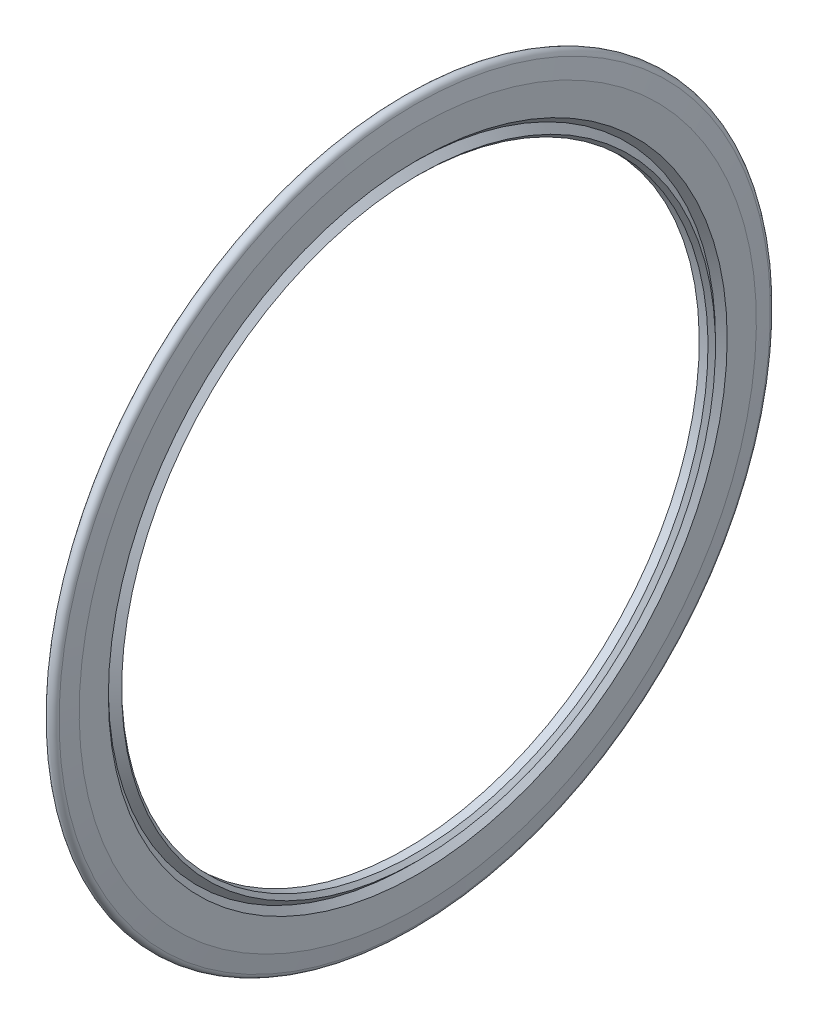
ISO-10303-21;
HEADER;
FILE_DESCRIPTION(('STEP AP214'),'2;1');
FILE_NAME('part.step','',(''),(''),'','','');
FILE_SCHEMA(('AUTOMOTIVE_DESIGN { 1 0 10303 214 1 1 1 1 }'));
ENDSEC;
DATA;
#1=APPLICATION_CONTEXT('core data for automotive mechanical design processes');
#2=APPLICATION_PROTOCOL_DEFINITION('international standard','automotive_design',2000,#1);
#3=PRODUCT_CONTEXT('',#1,'mechanical');
#4=PRODUCT('Part','Part','',(#3));
#5=PRODUCT_RELATED_PRODUCT_CATEGORY('part','',(#4));
#6=PRODUCT_DEFINITION_FORMATION('','',#4);
#7=PRODUCT_DEFINITION_CONTEXT('part definition',#1,'design');
#8=PRODUCT_DEFINITION('design','',#6,#7);
#9=PRODUCT_DEFINITION_SHAPE('','',#8);
#10=(LENGTH_UNIT() NAMED_UNIT(*) SI_UNIT(.MILLI.,.METRE.));
#11=(NAMED_UNIT(*) PLANE_ANGLE_UNIT() SI_UNIT($,.RADIAN.));
#12=(NAMED_UNIT(*) SI_UNIT($,.STERADIAN.) SOLID_ANGLE_UNIT());
#13=UNCERTAINTY_MEASURE_WITH_UNIT(LENGTH_MEASURE(1.E-05),#10,'distance_accuracy_value','');
#14=(GEOMETRIC_REPRESENTATION_CONTEXT(3) GLOBAL_UNCERTAINTY_ASSIGNED_CONTEXT((#13)) GLOBAL_UNIT_ASSIGNED_CONTEXT((#10,
#11,#12)) REPRESENTATION_CONTEXT('',''));
#15=CARTESIAN_POINT('',(0.,0.,0.));
#16=DIRECTION('',(0.,0.,1.));
#17=DIRECTION('',(1.,0.,0.));
#18=AXIS2_PLACEMENT_3D('',#15,#16,#17);
#19=CARTESIAN_POINT('',(0.135,16.14177,0.));
#20=DIRECTION('',(-1.,0.,0.));
#21=DIRECTION('',(0.,-1.,0.));
#22=AXIS2_PLACEMENT_3D('',#19,#20,#21);
#23=PLANE('',#22);
#24=CARTESIAN_POINT('',(0.135,0.,0.));
#25=DIRECTION('',(1.,0.,0.));
#26=DIRECTION('',(0.,1.,0.));
#27=AXIS2_PLACEMENT_3D('',#24,#25,#26);
#28=CIRCLE('',#27,15.91719);
#29=CARTESIAN_POINT('',(0.135,15.91719,0.));
#30=VERTEX_POINT('',#29);
#31=EDGE_CURVE('E11',#30,#30,#28,.T.);
#32=ORIENTED_EDGE('',*,*,#31,.T.);
#33=EDGE_LOOP('',(#32));
#34=FACE_BOUND('',#33,.T.);
#35=CARTESIAN_POINT('',(0.135,0.,0.));
#36=DIRECTION('',(1.,0.,0.));
#37=DIRECTION('',(0.,1.,0.));
#38=AXIS2_PLACEMENT_3D('',#35,#36,#37);
#39=CIRCLE('',#38,16.36635);
#40=CARTESIAN_POINT('',(0.135,16.36635,0.));
#41=VERTEX_POINT('',#40);
#42=EDGE_CURVE('E82',#41,#41,#39,.T.);
#43=ORIENTED_EDGE('',*,*,#42,.F.);
#44=EDGE_LOOP('',(#43));
#45=FACE_BOUND('',#44,.T.);
#46=ADVANCED_FACE('F16',(#34,#45),#23,.T.);
#47=CARTESIAN_POINT('',(0.2025,0.,0.));
#48=DIRECTION('',(-1.,0.,0.));
#49=DIRECTION('',(0.,1.,0.));
#50=AXIS2_PLACEMENT_3D('',#47,#48,#49);
#51=CONICAL_SURFACE('',#50,15.84969,0.785398163397441);
#52=CARTESIAN_POINT('',(0.27,0.,0.));
#53=DIRECTION('',(1.,0.,0.));
#54=DIRECTION('',(0.,1.,0.));
#55=AXIS2_PLACEMENT_3D('',#52,#53,#54);
#56=CIRCLE('',#55,15.78219);
#57=CARTESIAN_POINT('',(0.27,15.78219,0.));
#58=VERTEX_POINT('',#57);
#59=EDGE_CURVE('E26',#58,#58,#56,.T.);
#60=ORIENTED_EDGE('',*,*,#59,.T.);
#61=EDGE_LOOP('',(#60));
#62=FACE_BOUND('',#61,.T.);
#63=ORIENTED_EDGE('',*,*,#31,.F.);
#64=EDGE_LOOP('',(#63));
#65=FACE_BOUND('',#64,.T.);
#66=ADVANCED_FACE('F112',(#62,#65),#51,.F.);
#67=CARTESIAN_POINT('',(0.27,15.075015,0.));
#68=DIRECTION('',(-1.,0.,0.));
#69=DIRECTION('',(0.,-1.,0.));
#70=AXIS2_PLACEMENT_3D('',#67,#68,#69);
#71=PLANE('',#70);
#72=CARTESIAN_POINT('',(0.27,0.,0.));
#73=DIRECTION('',(1.,0.,0.));
#74=DIRECTION('',(0.,1.,0.));
#75=AXIS2_PLACEMENT_3D('',#72,#73,#74);
#76=CIRCLE('',#75,14.36784);
#77=CARTESIAN_POINT('',(0.27,14.36784,0.));
#78=VERTEX_POINT('',#77);
#79=EDGE_CURVE('E86',#78,#78,#76,.T.);
#80=ORIENTED_EDGE('',*,*,#79,.T.);
#81=EDGE_LOOP('',(#80));
#82=FACE_BOUND('',#81,.T.);
#83=ORIENTED_EDGE('',*,*,#59,.F.);
#84=EDGE_LOOP('',(#83));
#85=FACE_BOUND('',#84,.T.);
#86=ADVANCED_FACE('F117',(#82,#85),#71,.T.);
#87=CARTESIAN_POINT('',(0.2025,0.,0.));
#88=DIRECTION('',(1.,0.,0.));
#89=DIRECTION('',(0.,1.,0.));
#90=AXIS2_PLACEMENT_3D('',#87,#88,#89);
#91=CONICAL_SURFACE('',#90,14.30034,0.785398163397453);
#92=CARTESIAN_POINT('',(0.135,0.,0.));
#93=DIRECTION('',(1.,0.,0.));
#94=DIRECTION('',(0.,1.,0.));
#95=AXIS2_PLACEMENT_3D('',#92,#93,#94);
#96=CIRCLE('',#95,14.23284);
#97=CARTESIAN_POINT('',(0.135,14.23284,0.));
#98=VERTEX_POINT('',#97);
#99=EDGE_CURVE('E87',#98,#98,#96,.T.);
#100=ORIENTED_EDGE('',*,*,#99,.T.);
#101=EDGE_LOOP('',(#100));
#102=FACE_BOUND('',#101,.T.);
#103=ORIENTED_EDGE('',*,*,#79,.F.);
#104=EDGE_LOOP('',(#103));
#105=FACE_BOUND('',#104,.T.);
#106=ADVANCED_FACE('F123',(#102,#105),#91,.T.);
#107=CARTESIAN_POINT('',(0.135,14.12055,0.));
#108=DIRECTION('',(-1.,0.,0.));
#109=DIRECTION('',(0.,-1.,0.));
#110=AXIS2_PLACEMENT_3D('',#107,#108,#109);
#111=PLANE('',#110);
#112=CARTESIAN_POINT('',(0.135,0.,0.));
#113=DIRECTION('',(1.,0.,0.));
#114=DIRECTION('',(0.,1.,0.));
#115=AXIS2_PLACEMENT_3D('',#112,#113,#114);
#116=CIRCLE('',#115,14.00826);
#117=CARTESIAN_POINT('',(0.135,14.00826,0.));
#118=VERTEX_POINT('',#117);
#119=EDGE_CURVE('E89',#118,#118,#116,.T.);
#120=ORIENTED_EDGE('',*,*,#119,.T.);
#121=EDGE_LOOP('',(#120));
#122=FACE_BOUND('',#121,.T.);
#123=ORIENTED_EDGE('',*,*,#99,.F.);
#124=EDGE_LOOP('',(#123));
#125=FACE_BOUND('',#124,.T.);
#126=ADVANCED_FACE('F18',(#122,#125),#111,.T.);
#127=CARTESIAN_POINT('',(0.2885131875,0.,0.));
#128=DIRECTION('',(-1.,0.,0.));
#129=DIRECTION('',(0.,1.,0.));
#130=AXIS2_PLACEMENT_3D('',#127,#128,#129);
#131=CONICAL_SURFACE('',#130,13.8547468125,0.785398163397447);
#132=CARTESIAN_POINT('',(0.442026375,0.,0.));
#133=DIRECTION('',(1.,0.,0.));
#134=DIRECTION('',(0.,1.,0.));
#135=AXIS2_PLACEMENT_3D('',#132,#133,#134);
#136=CIRCLE('',#135,13.701233625);
#137=CARTESIAN_POINT('',(0.442026375,13.701233625,0.));
#138=VERTEX_POINT('',#137);
#139=EDGE_CURVE('E91',#138,#138,#136,.T.);
#140=ORIENTED_EDGE('',*,*,#139,.T.);
#141=EDGE_LOOP('',(#140));
#142=FACE_BOUND('',#141,.T.);
#143=ORIENTED_EDGE('',*,*,#119,.F.);
#144=EDGE_LOOP('',(#143));
#145=FACE_BOUND('',#144,.T.);
#146=ADVANCED_FACE('F151',(#142,#145),#131,.F.);
#147=CARTESIAN_POINT('',(0.3560131875,0.,0.));
#148=DIRECTION('',(1.,0.,0.));
#149=DIRECTION('',(0.,1.,0.));
#150=AXIS2_PLACEMENT_3D('',#147,#148,#149);
#151=CONICAL_SURFACE('',#150,13.6152204375,0.785398163397447);
#152=CARTESIAN_POINT('',(0.27,0.,0.));
#153=DIRECTION('',(1.,0.,0.));
#154=DIRECTION('',(0.,1.,0.));
#155=AXIS2_PLACEMENT_3D('',#152,#153,#154);
#156=CIRCLE('',#155,13.52920725);
#157=CARTESIAN_POINT('',(0.27,13.52920725,0.));
#158=VERTEX_POINT('',#157);
#159=EDGE_CURVE('E73',#158,#158,#156,.T.);
#160=ORIENTED_EDGE('',*,*,#159,.T.);
#161=EDGE_LOOP('',(#160));
#162=FACE_BOUND('',#161,.T.);
#163=ORIENTED_EDGE('',*,*,#139,.F.);
#164=EDGE_LOOP('',(#163));
#165=FACE_BOUND('',#164,.T.);
#166=ADVANCED_FACE('F145',(#162,#165),#151,.T.);
#167=CARTESIAN_POINT('',(0.4725,0.,0.));
#168=DIRECTION('',(-1.,0.,0.));
#169=DIRECTION('',(0.,1.,0.));
#170=AXIS2_PLACEMENT_3D('',#167,#168,#169);
#171=CYLINDRICAL_SURFACE('',#170,13.52920725);
#172=CARTESIAN_POINT('',(0.675,0.,0.));
#173=DIRECTION('',(1.,0.,0.));
#174=DIRECTION('',(0.,1.,0.));
#175=AXIS2_PLACEMENT_3D('',#172,#173,#174);
#176=CIRCLE('',#175,13.52920725);
#177=CARTESIAN_POINT('',(0.675,13.52920725,0.));
#178=VERTEX_POINT('',#177);
#179=EDGE_CURVE('E71',#178,#178,#176,.T.);
#180=ORIENTED_EDGE('',*,*,#179,.T.);
#181=EDGE_LOOP('',(#180));
#182=FACE_BOUND('',#181,.T.);
#183=ORIENTED_EDGE('',*,*,#159,.F.);
#184=EDGE_LOOP('',(#183));
#185=FACE_BOUND('',#184,.T.);
#186=ADVANCED_FACE('F141',(#182,#185),#171,.F.);
#187=CARTESIAN_POINT('',(0.7610131875,0.,0.));
#188=DIRECTION('',(1.,0.,0.));
#189=DIRECTION('',(0.,1.,0.));
#190=AXIS2_PLACEMENT_3D('',#187,#188,#189);
#191=CONICAL_SURFACE('',#190,13.6152204375,0.785398163397452);
#192=CARTESIAN_POINT('',(0.847026374999999,0.,0.));
#193=DIRECTION('',(1.,0.,0.));
#194=DIRECTION('',(0.,1.,0.));
#195=AXIS2_PLACEMENT_3D('',#192,#193,#194);
#196=CIRCLE('',#195,13.701233625);
#197=CARTESIAN_POINT('',(0.847026374999999,13.701233625,0.));
#198=VERTEX_POINT('',#197);
#199=EDGE_CURVE('E20',#198,#198,#196,.T.);
#200=ORIENTED_EDGE('',*,*,#199,.T.);
#201=EDGE_LOOP('',(#200));
#202=FACE_BOUND('',#201,.T.);
#203=ORIENTED_EDGE('',*,*,#179,.F.);
#204=EDGE_LOOP('',(#203));
#205=FACE_BOUND('',#204,.T.);
#206=ADVANCED_FACE('F68',(#202,#205),#191,.F.);
#207=CARTESIAN_POINT('',(0.6935131875,0.,0.));
#208=DIRECTION('',(-1.,0.,0.));
#209=DIRECTION('',(0.,1.,0.));
#210=AXIS2_PLACEMENT_3D('',#207,#208,#209);
#211=CONICAL_SURFACE('',#210,13.8547468125,0.785398163397449);
#212=CARTESIAN_POINT('',(0.54,0.,0.));
#213=DIRECTION('',(1.,0.,0.));
#214=DIRECTION('',(0.,1.,0.));
#215=AXIS2_PLACEMENT_3D('',#212,#213,#214);
#216=CIRCLE('',#215,14.00826);
#217=CARTESIAN_POINT('',(0.54,14.00826,0.));
#218=VERTEX_POINT('',#217);
#219=EDGE_CURVE('E72',#218,#218,#216,.T.);
#220=ORIENTED_EDGE('',*,*,#219,.T.);
#221=EDGE_LOOP('',(#220));
#222=FACE_BOUND('',#221,.T.);
#223=ORIENTED_EDGE('',*,*,#199,.F.);
#224=EDGE_LOOP('',(#223));
#225=FACE_BOUND('',#224,.T.);
#226=ADVANCED_FACE('F133',(#222,#225),#211,.T.);
#227=CARTESIAN_POINT('',(0.675,0.,0.));
#228=DIRECTION('',(1.,0.,0.));
#229=DIRECTION('',(0.,1.,0.));
#230=AXIS2_PLACEMENT_3D('',#227,#228,#229);
#231=CONICAL_SURFACE('',#230,14.14326,0.785398163397443);
#232=CARTESIAN_POINT('',(0.81,0.,0.));
#233=DIRECTION('',(1.,0.,0.));
#234=DIRECTION('',(0.,1.,0.));
#235=AXIS2_PLACEMENT_3D('',#232,#233,#234);
#236=CIRCLE('',#235,14.27826);
#237=CARTESIAN_POINT('',(0.81,14.27826,0.));
#238=VERTEX_POINT('',#237);
#239=EDGE_CURVE('E75',#238,#238,#236,.T.);
#240=ORIENTED_EDGE('',*,*,#239,.T.);
#241=EDGE_LOOP('',(#240));
#242=FACE_BOUND('',#241,.T.);
#243=ORIENTED_EDGE('',*,*,#219,.F.);
#244=EDGE_LOOP('',(#243));
#245=FACE_BOUND('',#244,.T.);
#246=ADVANCED_FACE('F131',(#242,#245),#231,.F.);
#247=CARTESIAN_POINT('',(0.81,14.9513044467518,0.));
#248=DIRECTION('',(1.,0.,0.));
#249=DIRECTION('',(0.,1.,0.));
#250=AXIS2_PLACEMENT_3D('',#247,#248,#249);
#251=PLANE('',#250);
#252=CARTESIAN_POINT('',(0.81,0.,0.));
#253=DIRECTION('',(1.,0.,0.));
#254=DIRECTION('',(0.,1.,0.));
#255=AXIS2_PLACEMENT_3D('',#252,#253,#254);
#256=CIRCLE('',#255,15.6243488935036);
#257=CARTESIAN_POINT('',(0.81,15.6243488935036,0.));
#258=VERTEX_POINT('',#257);
#259=EDGE_CURVE('E79',#258,#258,#256,.T.);
#260=ORIENTED_EDGE('',*,*,#259,.T.);
#261=EDGE_LOOP('',(#260));
#262=FACE_BOUND('',#261,.T.);
#263=ORIENTED_EDGE('',*,*,#239,.F.);
#264=EDGE_LOOP('',(#263));
#265=FACE_BOUND('',#264,.T.);
#266=ADVANCED_FACE('F108',(#262,#265),#251,.T.);
#267=CARTESIAN_POINT('',(0.740449046656649,0.,0.));
#268=DIRECTION('',(-1.,0.,0.));
#269=DIRECTION('',(0.,1.,0.));
#270=AXIS2_PLACEMENT_3D('',#267,#268,#269);
#271=CONICAL_SURFACE('',#270,16.0187919507369,1.39626340159546);
#272=CARTESIAN_POINT('',(0.670898093313297,0.,0.));
#273=DIRECTION('',(1.,0.,0.));
#274=DIRECTION('',(0.,1.,0.));
#275=AXIS2_PLACEMENT_3D('',#272,#273,#274);
#276=CIRCLE('',#275,16.4132350079701);
#277=CARTESIAN_POINT('',(0.670898093313297,16.4132350079701,0.));
#278=VERTEX_POINT('',#277);
#279=EDGE_CURVE('E84',#278,#278,#276,.T.);
#280=ORIENTED_EDGE('',*,*,#279,.T.);
#281=EDGE_LOOP('',(#280));
#282=FACE_BOUND('',#281,.T.);
#283=ORIENTED_EDGE('',*,*,#259,.F.);
#284=EDGE_LOOP('',(#283));
#285=FACE_BOUND('',#284,.T.);
#286=ADVANCED_FACE('F97',(#282,#285),#271,.T.);
#287=CARTESIAN_POINT('',(0.405,0.,0.));
#288=DIRECTION('',(1.,0.,0.));
#289=DIRECTION('',(0.,0.,-1.));
#290=AXIS2_PLACEMENT_3D('',#287,#288,#289);
#291=TOROIDAL_SURFACE('',#290,16.36635,0.27);
#292=ORIENTED_EDGE('',*,*,#42,.T.);
#293=EDGE_LOOP('',(#292));
#294=FACE_BOUND('',#293,.T.);
#295=ORIENTED_EDGE('',*,*,#279,.F.);
#296=EDGE_LOOP('',(#295));
#297=FACE_BOUND('',#296,.T.);
#298=ADVANCED_FACE('F100',(#294,#297),#291,.T.);
#299=CLOSED_SHELL('',(#46,#66,#86,#106,#126,#146,#166,#186,#206,#226,#246,#266,#286,#298));
#300=MANIFOLD_SOLID_BREP('B1',#299);
#301=ADVANCED_BREP_SHAPE_REPRESENTATION('',(#18,#300),#14);
#302=SHAPE_DEFINITION_REPRESENTATION(#9,#301);
ENDSEC;
END-ISO-10303-21;
